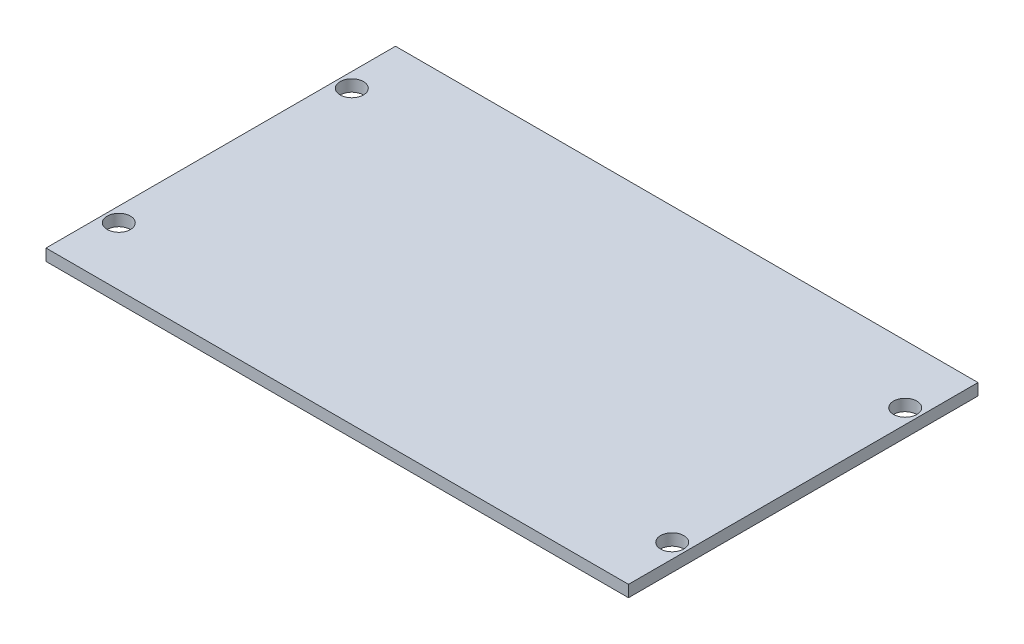
ISO-10303-21;
HEADER;
FILE_DESCRIPTION(('STEP AP214'),'2;1');
FILE_NAME('part.step','',(''),(''),'','','');
FILE_SCHEMA(('AUTOMOTIVE_DESIGN { 1 0 10303 214 1 1 1 1 }'));
ENDSEC;
DATA;
#1=APPLICATION_CONTEXT('core data for automotive mechanical design processes');
#2=APPLICATION_PROTOCOL_DEFINITION('international standard','automotive_design',2000,#1);
#3=PRODUCT_CONTEXT('',#1,'mechanical');
#4=PRODUCT('Part','Part','',(#3));
#5=PRODUCT_RELATED_PRODUCT_CATEGORY('part','',(#4));
#6=PRODUCT_DEFINITION_FORMATION('','',#4);
#7=PRODUCT_DEFINITION_CONTEXT('part definition',#1,'design');
#8=PRODUCT_DEFINITION('design','',#6,#7);
#9=PRODUCT_DEFINITION_SHAPE('','',#8);
#10=(LENGTH_UNIT() NAMED_UNIT(*) SI_UNIT(.MILLI.,.METRE.));
#11=(NAMED_UNIT(*) PLANE_ANGLE_UNIT() SI_UNIT($,.RADIAN.));
#12=(NAMED_UNIT(*) SI_UNIT($,.STERADIAN.) SOLID_ANGLE_UNIT());
#13=UNCERTAINTY_MEASURE_WITH_UNIT(LENGTH_MEASURE(1.E-05),#10,'distance_accuracy_value','');
#14=(GEOMETRIC_REPRESENTATION_CONTEXT(3) GLOBAL_UNCERTAINTY_ASSIGNED_CONTEXT((#13)) GLOBAL_UNIT_ASSIGNED_CONTEXT((#10,
#11,#12)) REPRESENTATION_CONTEXT('',''));
#15=CARTESIAN_POINT('',(0.,0.,0.));
#16=DIRECTION('',(0.,0.,1.));
#17=DIRECTION('',(1.,0.,0.));
#18=AXIS2_PLACEMENT_3D('',#15,#16,#17);
#19=CARTESIAN_POINT('',(0.,2.,0.));
#20=DIRECTION('',(1.,0.,0.));
#21=DIRECTION('',(0.,0.,-1.));
#22=AXIS2_PLACEMENT_3D('',#19,#20,#21);
#23=PLANE('',#22);
#24=DIRECTION('',(0.,0.,1.));
#25=VECTOR('',#24,1.);
#26=CARTESIAN_POINT('',(0.,0.,0.));
#27=LINE('',#26,#25);
#28=CARTESIAN_POINT('',(0.,0.,-60.));
#29=VERTEX_POINT('',#28);
#30=CARTESIAN_POINT('',(0.,0.,0.));
#31=VERTEX_POINT('',#30);
#32=EDGE_CURVE('E104',#29,#31,#27,.T.);
#33=ORIENTED_EDGE('',*,*,#32,.T.);
#34=DIRECTION('',(0.,-1.,0.));
#35=VECTOR('',#34,1.);
#36=CARTESIAN_POINT('',(0.,2.,0.));
#37=LINE('',#36,#35);
#38=CARTESIAN_POINT('',(0.,2.,0.));
#39=VERTEX_POINT('',#38);
#40=EDGE_CURVE('E11',#39,#31,#37,.T.);
#41=ORIENTED_EDGE('',*,*,#40,.F.);
#42=DIRECTION('',(0.,0.,1.));
#43=VECTOR('',#42,1.);
#44=CARTESIAN_POINT('',(0.,2.,0.));
#45=LINE('',#44,#43);
#46=CARTESIAN_POINT('',(0.,2.,-60.));
#47=VERTEX_POINT('',#46);
#48=EDGE_CURVE('E92',#47,#39,#45,.T.);
#49=ORIENTED_EDGE('',*,*,#48,.F.);
#50=DIRECTION('',(0.,-1.,0.));
#51=VECTOR('',#50,1.);
#52=CARTESIAN_POINT('',(0.,2.,-60.));
#53=LINE('',#52,#51);
#54=EDGE_CURVE('E100',#47,#29,#53,.T.);
#55=ORIENTED_EDGE('',*,*,#54,.T.);
#56=EDGE_LOOP('',(#33,#41,#49,#55));
#57=FACE_BOUND('',#56,.T.);
#58=ADVANCED_FACE('F41',(#57),#23,.F.);
#59=CARTESIAN_POINT('',(0.,2.,0.));
#60=DIRECTION('',(0.,0.,-1.));
#61=DIRECTION('',(-1.,0.,0.));
#62=AXIS2_PLACEMENT_3D('',#59,#60,#61);
#63=PLANE('',#62);
#64=DIRECTION('',(1.,0.,0.));
#65=VECTOR('',#64,1.);
#66=CARTESIAN_POINT('',(0.,0.,0.));
#67=LINE('',#66,#65);
#68=CARTESIAN_POINT('',(100.,0.,0.));
#69=VERTEX_POINT('',#68);
#70=EDGE_CURVE('E96',#31,#69,#67,.T.);
#71=ORIENTED_EDGE('',*,*,#70,.T.);
#72=DIRECTION('',(0.,-1.,0.));
#73=VECTOR('',#72,1.);
#74=CARTESIAN_POINT('',(100.,2.,0.));
#75=LINE('',#74,#73);
#76=CARTESIAN_POINT('',(100.,2.,0.));
#77=VERTEX_POINT('',#76);
#78=EDGE_CURVE('E49',#77,#69,#75,.T.);
#79=ORIENTED_EDGE('',*,*,#78,.F.);
#80=DIRECTION('',(1.,0.,0.));
#81=VECTOR('',#80,1.);
#82=CARTESIAN_POINT('',(0.,2.,0.));
#83=LINE('',#82,#81);
#84=EDGE_CURVE('E87',#39,#77,#83,.T.);
#85=ORIENTED_EDGE('',*,*,#84,.F.);
#86=ORIENTED_EDGE('',*,*,#40,.T.);
#87=EDGE_LOOP('',(#71,#79,#85,#86));
#88=FACE_BOUND('',#87,.T.);
#89=ADVANCED_FACE('F95',(#88),#63,.F.);
#90=CARTESIAN_POINT('',(100.,2.,0.));
#91=DIRECTION('',(-1.,0.,0.));
#92=DIRECTION('',(0.,0.,1.));
#93=AXIS2_PLACEMENT_3D('',#90,#91,#92);
#94=PLANE('',#93);
#95=DIRECTION('',(0.,0.,-1.));
#96=VECTOR('',#95,1.);
#97=CARTESIAN_POINT('',(100.,0.,0.));
#98=LINE('',#97,#96);
#99=CARTESIAN_POINT('',(100.,0.,-60.));
#100=VERTEX_POINT('',#99);
#101=EDGE_CURVE('E74',#69,#100,#98,.T.);
#102=ORIENTED_EDGE('',*,*,#101,.T.);
#103=DIRECTION('',(0.,-1.,0.));
#104=VECTOR('',#103,1.);
#105=CARTESIAN_POINT('',(100.,2.,-60.));
#106=LINE('',#105,#104);
#107=CARTESIAN_POINT('',(100.,2.,-60.));
#108=VERTEX_POINT('',#107);
#109=EDGE_CURVE('E97',#108,#100,#106,.T.);
#110=ORIENTED_EDGE('',*,*,#109,.F.);
#111=DIRECTION('',(0.,0.,-1.));
#112=VECTOR('',#111,1.);
#113=CARTESIAN_POINT('',(100.,2.,0.));
#114=LINE('',#113,#112);
#115=EDGE_CURVE('E90',#77,#108,#114,.T.);
#116=ORIENTED_EDGE('',*,*,#115,.F.);
#117=ORIENTED_EDGE('',*,*,#78,.T.);
#118=EDGE_LOOP('',(#102,#110,#116,#117));
#119=FACE_BOUND('',#118,.T.);
#120=ADVANCED_FACE('F98',(#119),#94,.F.);
#121=CARTESIAN_POINT('',(0.,2.,-60.));
#122=DIRECTION('',(0.,0.,1.));
#123=DIRECTION('',(1.,0.,0.));
#124=AXIS2_PLACEMENT_3D('',#121,#122,#123);
#125=PLANE('',#124);
#126=DIRECTION('',(-1.,0.,0.));
#127=VECTOR('',#126,1.);
#128=CARTESIAN_POINT('',(0.,0.,-60.));
#129=LINE('',#128,#127);
#130=EDGE_CURVE('E80',#100,#29,#129,.T.);
#131=ORIENTED_EDGE('',*,*,#130,.T.);
#132=ORIENTED_EDGE('',*,*,#54,.F.);
#133=DIRECTION('',(-1.,0.,0.));
#134=VECTOR('',#133,1.);
#135=CARTESIAN_POINT('',(0.,2.,-60.));
#136=LINE('',#135,#134);
#137=EDGE_CURVE('E57',#108,#47,#136,.T.);
#138=ORIENTED_EDGE('',*,*,#137,.F.);
#139=ORIENTED_EDGE('',*,*,#109,.T.);
#140=EDGE_LOOP('',(#131,#132,#138,#139));
#141=FACE_BOUND('',#140,.T.);
#142=ADVANCED_FACE('F112',(#141),#125,.F.);
#143=CARTESIAN_POINT('',(0.,2.,0.));
#144=DIRECTION('',(0.,-1.,0.));
#145=DIRECTION('',(0.,0.,-1.));
#146=AXIS2_PLACEMENT_3D('',#143,#144,#145);
#147=PLANE('',#146);
#148=CARTESIAN_POINT('',(97.5,2.,-9.99999999999999));
#149=DIRECTION('',(0.,1.,0.));
#150=DIRECTION('',(0.,0.,-1.));
#151=AXIS2_PLACEMENT_3D('',#148,#149,#150);
#152=CIRCLE('',#151,2.);
#153=CARTESIAN_POINT('',(97.5,2.,-12.));
#154=VERTEX_POINT('',#153);
#155=EDGE_CURVE('E123',#154,#154,#152,.T.);
#156=ORIENTED_EDGE('',*,*,#155,.F.);
#157=EDGE_LOOP('',(#156));
#158=FACE_BOUND('',#157,.T.);
#159=CARTESIAN_POINT('',(2.5,2.,-50.));
#160=DIRECTION('',(0.,1.,0.));
#161=DIRECTION('',(0.,0.,-1.));
#162=AXIS2_PLACEMENT_3D('',#159,#160,#161);
#163=CIRCLE('',#162,2.);
#164=CARTESIAN_POINT('',(2.5,2.,-52.));
#165=VERTEX_POINT('',#164);
#166=EDGE_CURVE('E124',#165,#165,#163,.T.);
#167=ORIENTED_EDGE('',*,*,#166,.F.);
#168=EDGE_LOOP('',(#167));
#169=FACE_BOUND('',#168,.T.);
#170=CARTESIAN_POINT('',(2.5,2.,-9.99999999999999));
#171=DIRECTION('',(0.,1.,0.));
#172=DIRECTION('',(0.,0.,1.));
#173=AXIS2_PLACEMENT_3D('',#170,#171,#172);
#174=CIRCLE('',#173,2.);
#175=CARTESIAN_POINT('',(2.5,2.,-8.));
#176=VERTEX_POINT('',#175);
#177=EDGE_CURVE('E131',#176,#176,#174,.T.);
#178=ORIENTED_EDGE('',*,*,#177,.F.);
#179=EDGE_LOOP('',(#178));
#180=FACE_BOUND('',#179,.T.);
#181=CARTESIAN_POINT('',(97.5,2.,-50.));
#182=DIRECTION('',(0.,1.,0.));
#183=DIRECTION('',(0.,0.,1.));
#184=AXIS2_PLACEMENT_3D('',#181,#182,#183);
#185=CIRCLE('',#184,2.);
#186=CARTESIAN_POINT('',(97.5,2.,-48.));
#187=VERTEX_POINT('',#186);
#188=EDGE_CURVE('E120',#187,#187,#185,.T.);
#189=ORIENTED_EDGE('',*,*,#188,.F.);
#190=EDGE_LOOP('',(#189));
#191=FACE_BOUND('',#190,.T.);
#192=ORIENTED_EDGE('',*,*,#48,.T.);
#193=ORIENTED_EDGE('',*,*,#84,.T.);
#194=ORIENTED_EDGE('',*,*,#115,.T.);
#195=ORIENTED_EDGE('',*,*,#137,.T.);
#196=EDGE_LOOP('',(#192,#193,#194,#195));
#197=FACE_BOUND('',#196,.T.);
#198=ADVANCED_FACE('F88',(#158,#169,#180,#191,#197),#147,.F.);
#199=CARTESIAN_POINT('',(0.,0.,0.));
#200=DIRECTION('',(0.,-1.,0.));
#201=DIRECTION('',(0.,0.,-1.));
#202=AXIS2_PLACEMENT_3D('',#199,#200,#201);
#203=PLANE('',#202);
#204=CARTESIAN_POINT('',(97.5,0.,-9.99999999999999));
#205=DIRECTION('',(0.,-1.,0.));
#206=DIRECTION('',(0.,0.,-1.));
#207=AXIS2_PLACEMENT_3D('',#204,#205,#206);
#208=CIRCLE('',#207,2.);
#209=CARTESIAN_POINT('',(97.5,0.,-12.));
#210=VERTEX_POINT('',#209);
#211=EDGE_CURVE('E127',#210,#210,#208,.F.);
#212=ORIENTED_EDGE('',*,*,#211,.T.);
#213=EDGE_LOOP('',(#212));
#214=FACE_BOUND('',#213,.T.);
#215=CARTESIAN_POINT('',(2.5,0.,-50.));
#216=DIRECTION('',(0.,-1.,0.));
#217=DIRECTION('',(0.,0.,-1.));
#218=AXIS2_PLACEMENT_3D('',#215,#216,#217);
#219=CIRCLE('',#218,2.);
#220=CARTESIAN_POINT('',(2.5,0.,-52.));
#221=VERTEX_POINT('',#220);
#222=EDGE_CURVE('E128',#221,#221,#219,.F.);
#223=ORIENTED_EDGE('',*,*,#222,.T.);
#224=EDGE_LOOP('',(#223));
#225=FACE_BOUND('',#224,.T.);
#226=CARTESIAN_POINT('',(2.5,0.,-9.99999999999999));
#227=DIRECTION('',(0.,-1.,0.));
#228=DIRECTION('',(0.,0.,-1.));
#229=AXIS2_PLACEMENT_3D('',#226,#227,#228);
#230=CIRCLE('',#229,2.);
#231=CARTESIAN_POINT('',(2.5,0.,-12.));
#232=VERTEX_POINT('',#231);
#233=EDGE_CURVE('E138',#232,#232,#230,.F.);
#234=ORIENTED_EDGE('',*,*,#233,.T.);
#235=EDGE_LOOP('',(#234));
#236=FACE_BOUND('',#235,.T.);
#237=CARTESIAN_POINT('',(97.5,0.,-50.));
#238=DIRECTION('',(0.,-1.,0.));
#239=DIRECTION('',(0.,0.,-1.));
#240=AXIS2_PLACEMENT_3D('',#237,#238,#239);
#241=CIRCLE('',#240,2.);
#242=CARTESIAN_POINT('',(97.5,0.,-52.));
#243=VERTEX_POINT('',#242);
#244=EDGE_CURVE('E107',#243,#243,#241,.F.);
#245=ORIENTED_EDGE('',*,*,#244,.T.);
#246=EDGE_LOOP('',(#245));
#247=FACE_BOUND('',#246,.T.);
#248=ORIENTED_EDGE('',*,*,#32,.F.);
#249=ORIENTED_EDGE('',*,*,#130,.F.);
#250=ORIENTED_EDGE('',*,*,#101,.F.);
#251=ORIENTED_EDGE('',*,*,#70,.F.);
#252=EDGE_LOOP('',(#248,#249,#250,#251));
#253=FACE_BOUND('',#252,.T.);
#254=ADVANCED_FACE('F115',(#214,#225,#236,#247,#253),#203,.T.);
#255=CARTESIAN_POINT('',(97.5,-5.65685424949238,-50.));
#256=DIRECTION('',(0.,1.,0.));
#257=DIRECTION('',(0.,0.,1.));
#258=AXIS2_PLACEMENT_3D('',#255,#256,#257);
#259=CYLINDRICAL_SURFACE('',#258,2.);
#260=ORIENTED_EDGE('',*,*,#188,.T.);
#261=EDGE_LOOP('',(#260));
#262=FACE_BOUND('',#261,.T.);
#263=ORIENTED_EDGE('',*,*,#244,.F.);
#264=EDGE_LOOP('',(#263));
#265=FACE_BOUND('',#264,.T.);
#266=ADVANCED_FACE('F147',(#262,#265),#259,.F.);
#267=CARTESIAN_POINT('',(2.5,-5.65685424949238,-9.99999999999999));
#268=DIRECTION('',(0.,1.,0.));
#269=DIRECTION('',(0.,0.,1.));
#270=AXIS2_PLACEMENT_3D('',#267,#268,#269);
#271=CYLINDRICAL_SURFACE('',#270,2.);
#272=ORIENTED_EDGE('',*,*,#177,.T.);
#273=EDGE_LOOP('',(#272));
#274=FACE_BOUND('',#273,.T.);
#275=ORIENTED_EDGE('',*,*,#233,.F.);
#276=EDGE_LOOP('',(#275));
#277=FACE_BOUND('',#276,.T.);
#278=ADVANCED_FACE('F144',(#274,#277),#271,.F.);
#279=CARTESIAN_POINT('',(2.5,-5.65685424949238,-50.));
#280=DIRECTION('',(0.,1.,0.));
#281=DIRECTION('',(0.,0.,1.));
#282=AXIS2_PLACEMENT_3D('',#279,#280,#281);
#283=CYLINDRICAL_SURFACE('',#282,2.);
#284=ORIENTED_EDGE('',*,*,#166,.T.);
#285=EDGE_LOOP('',(#284));
#286=FACE_BOUND('',#285,.T.);
#287=ORIENTED_EDGE('',*,*,#222,.F.);
#288=EDGE_LOOP('',(#287));
#289=FACE_BOUND('',#288,.T.);
#290=ADVANCED_FACE('F146',(#286,#289),#283,.F.);
#291=CARTESIAN_POINT('',(97.5,-5.65685424949238,-9.99999999999999));
#292=DIRECTION('',(0.,1.,0.));
#293=DIRECTION('',(0.,0.,1.));
#294=AXIS2_PLACEMENT_3D('',#291,#292,#293);
#295=CYLINDRICAL_SURFACE('',#294,2.);
#296=ORIENTED_EDGE('',*,*,#155,.T.);
#297=EDGE_LOOP('',(#296));
#298=FACE_BOUND('',#297,.T.);
#299=ORIENTED_EDGE('',*,*,#211,.F.);
#300=EDGE_LOOP('',(#299));
#301=FACE_BOUND('',#300,.T.);
#302=ADVANCED_FACE('F154',(#298,#301),#295,.F.);
#303=CLOSED_SHELL('',(#58,#89,#120,#142,#198,#254,#266,#278,#290,#302));
#304=MANIFOLD_SOLID_BREP('B2',#303);
#305=ADVANCED_BREP_SHAPE_REPRESENTATION('',(#18,#304),#14);
#306=SHAPE_DEFINITION_REPRESENTATION(#9,#305);
ENDSEC;
END-ISO-10303-21;
